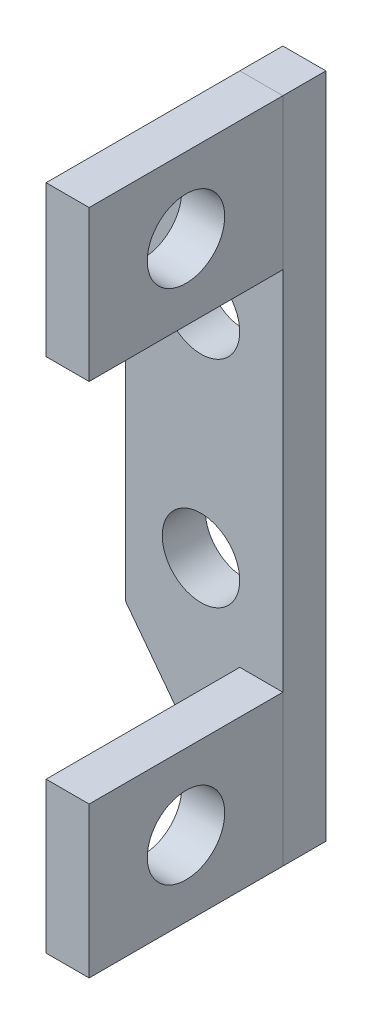
ISO-10303-21;
HEADER;
FILE_DESCRIPTION(('STEP AP214'),'2;1');
FILE_NAME('part.step','',(''),(''),'','','');
FILE_SCHEMA(('AUTOMOTIVE_DESIGN { 1 0 10303 214 1 1 1 1 }'));
ENDSEC;
DATA;
#1=APPLICATION_CONTEXT('core data for automotive mechanical design processes');
#2=APPLICATION_PROTOCOL_DEFINITION('international standard','automotive_design',2000,#1);
#3=PRODUCT_CONTEXT('',#1,'mechanical');
#4=PRODUCT('Part','Part','',(#3));
#5=PRODUCT_RELATED_PRODUCT_CATEGORY('part','',(#4));
#6=PRODUCT_DEFINITION_FORMATION('','',#4);
#7=PRODUCT_DEFINITION_CONTEXT('part definition',#1,'design');
#8=PRODUCT_DEFINITION('design','',#6,#7);
#9=PRODUCT_DEFINITION_SHAPE('','',#8);
#10=(LENGTH_UNIT() NAMED_UNIT(*) SI_UNIT(.MILLI.,.METRE.));
#11=(NAMED_UNIT(*) PLANE_ANGLE_UNIT() SI_UNIT($,.RADIAN.));
#12=(NAMED_UNIT(*) SI_UNIT($,.STERADIAN.) SOLID_ANGLE_UNIT());
#13=UNCERTAINTY_MEASURE_WITH_UNIT(LENGTH_MEASURE(1.E-05),#10,'distance_accuracy_value','');
#14=(GEOMETRIC_REPRESENTATION_CONTEXT(3) GLOBAL_UNCERTAINTY_ASSIGNED_CONTEXT((#13)) GLOBAL_UNIT_ASSIGNED_CONTEXT((#10,
#11,#12)) REPRESENTATION_CONTEXT('',''));
#15=CARTESIAN_POINT('',(0.,0.,0.));
#16=DIRECTION('',(0.,0.,1.));
#17=DIRECTION('',(1.,0.,0.));
#18=AXIS2_PLACEMENT_3D('',#15,#16,#17);
#19=CARTESIAN_POINT('',(-2.6955897908607,196.920635549074,11.));
#20=DIRECTION('',(-1.,0.,0.));
#21=DIRECTION('',(0.,0.,1.));
#22=AXIS2_PLACEMENT_3D('',#19,#20,#21);
#23=PLANE('',#22);
#24=CARTESIAN_POINT('',(-2.6955897908607,193.420635549076,6.5));
#25=DIRECTION('',(-1.,0.,0.));
#26=DIRECTION('',(0.,0.,1.));
#27=AXIS2_PLACEMENT_3D('',#24,#25,#26);
#28=CIRCLE('',#27,1.8);
#29=CARTESIAN_POINT('',(-2.6955897908607,193.420635549076,8.3));
#30=VERTEX_POINT('',#29);
#31=EDGE_CURVE('E123',#30,#30,#28,.T.);
#32=ORIENTED_EDGE('',*,*,#31,.T.);
#33=EDGE_LOOP('',(#32));
#34=FACE_BOUND('',#33,.T.);
#35=DIRECTION('',(0.,1.,0.));
#36=VECTOR('',#35,1.);
#37=CARTESIAN_POINT('',(-2.6955897908607,196.920635549074,2.));
#38=LINE('',#37,#36);
#39=CARTESIAN_POINT('',(-2.6955897908607,189.920635549074,2.));
#40=VERTEX_POINT('',#39);
#41=CARTESIAN_POINT('',(-2.6955897908607,196.920635549074,2.));
#42=VERTEX_POINT('',#41);
#43=EDGE_CURVE('E12',#40,#42,#38,.T.);
#44=ORIENTED_EDGE('',*,*,#43,.T.);
#45=DIRECTION('',(0.,0.,-1.));
#46=VECTOR('',#45,1.);
#47=CARTESIAN_POINT('',(-2.6955897908607,196.920635549074,11.));
#48=LINE('',#47,#46);
#49=CARTESIAN_POINT('',(-2.6955897908607,196.920635549074,11.));
#50=VERTEX_POINT('',#49);
#51=EDGE_CURVE('E122',#50,#42,#48,.T.);
#52=ORIENTED_EDGE('',*,*,#51,.F.);
#53=DIRECTION('',(0.,1.,0.));
#54=VECTOR('',#53,1.);
#55=CARTESIAN_POINT('',(-2.6955897908607,196.920635549074,11.));
#56=LINE('',#55,#54);
#57=CARTESIAN_POINT('',(-2.6955897908607,189.920635549074,11.));
#58=VERTEX_POINT('',#57);
#59=EDGE_CURVE('E55',#58,#50,#56,.T.);
#60=ORIENTED_EDGE('',*,*,#59,.F.);
#61=DIRECTION('',(0.,0.,-1.));
#62=VECTOR('',#61,1.);
#63=CARTESIAN_POINT('',(-2.6955897908607,189.920635549074,11.));
#64=LINE('',#63,#62);
#65=EDGE_CURVE('E110',#58,#40,#64,.T.);
#66=ORIENTED_EDGE('',*,*,#65,.T.);
#67=EDGE_LOOP('',(#44,#52,#60,#66));
#68=FACE_BOUND('',#67,.T.);
#69=ADVANCED_FACE('F51',(#34,#68),#23,.F.);
#70=CARTESIAN_POINT('',(-2.6955897908607,196.920635549074,11.));
#71=DIRECTION('',(0.,-1.,0.));
#72=DIRECTION('',(0.,0.,-1.));
#73=AXIS2_PLACEMENT_3D('',#70,#71,#72);
#74=PLANE('',#73);
#75=DIRECTION('',(-1.,0.,0.));
#76=VECTOR('',#75,1.);
#77=CARTESIAN_POINT('',(-2.6955897908607,196.920635549074,2.));
#78=LINE('',#77,#76);
#79=CARTESIAN_POINT('',(-4.6955897908607,196.920635549074,2.));
#80=VERTEX_POINT('',#79);
#81=EDGE_CURVE('E61',#42,#80,#78,.T.);
#82=ORIENTED_EDGE('',*,*,#81,.T.);
#83=DIRECTION('',(0.,0.,-1.));
#84=VECTOR('',#83,1.);
#85=CARTESIAN_POINT('',(-4.6955897908607,196.920635549074,11.));
#86=LINE('',#85,#84);
#87=CARTESIAN_POINT('',(-4.6955897908607,196.920635549074,11.));
#88=VERTEX_POINT('',#87);
#89=EDGE_CURVE('E106',#88,#80,#86,.T.);
#90=ORIENTED_EDGE('',*,*,#89,.F.);
#91=DIRECTION('',(-1.,0.,0.));
#92=VECTOR('',#91,1.);
#93=CARTESIAN_POINT('',(-2.6955897908607,196.920635549074,11.));
#94=LINE('',#93,#92);
#95=EDGE_CURVE('E85',#50,#88,#94,.T.);
#96=ORIENTED_EDGE('',*,*,#95,.F.);
#97=ORIENTED_EDGE('',*,*,#51,.T.);
#98=EDGE_LOOP('',(#82,#90,#96,#97));
#99=FACE_BOUND('',#98,.T.);
#100=ADVANCED_FACE('F136',(#99),#74,.F.);
#101=CARTESIAN_POINT('',(-4.6955897908607,196.920635549074,11.));
#102=DIRECTION('',(1.,0.,0.));
#103=DIRECTION('',(0.,0.,-1.));
#104=AXIS2_PLACEMENT_3D('',#101,#102,#103);
#105=PLANE('',#104);
#106=CARTESIAN_POINT('',(-4.6955897908607,193.420635549076,6.5));
#107=DIRECTION('',(-1.,0.,0.));
#108=DIRECTION('',(0.,0.,1.));
#109=AXIS2_PLACEMENT_3D('',#106,#107,#108);
#110=CIRCLE('',#109,1.8);
#111=CARTESIAN_POINT('',(-4.6955897908607,193.420635549076,8.3));
#112=VERTEX_POINT('',#111);
#113=EDGE_CURVE('E127',#112,#112,#110,.T.);
#114=ORIENTED_EDGE('',*,*,#113,.F.);
#115=EDGE_LOOP('',(#114));
#116=FACE_BOUND('',#115,.T.);
#117=DIRECTION('',(0.,-1.,0.));
#118=VECTOR('',#117,1.);
#119=CARTESIAN_POINT('',(-4.6955897908607,196.920635549074,2.));
#120=LINE('',#119,#118);
#121=CARTESIAN_POINT('',(-4.6955897908607,189.920635549074,2.));
#122=VERTEX_POINT('',#121);
#123=EDGE_CURVE('E101',#80,#122,#120,.T.);
#124=ORIENTED_EDGE('',*,*,#123,.T.);
#125=DIRECTION('',(0.,0.,-1.));
#126=VECTOR('',#125,1.);
#127=CARTESIAN_POINT('',(-4.6955897908607,189.920635549074,11.));
#128=LINE('',#127,#126);
#129=CARTESIAN_POINT('',(-4.6955897908607,189.920635549074,11.));
#130=VERTEX_POINT('',#129);
#131=EDGE_CURVE('E104',#130,#122,#128,.T.);
#132=ORIENTED_EDGE('',*,*,#131,.F.);
#133=DIRECTION('',(0.,-1.,0.));
#134=VECTOR('',#133,1.);
#135=CARTESIAN_POINT('',(-4.6955897908607,196.920635549074,11.));
#136=LINE('',#135,#134);
#137=EDGE_CURVE('E118',#88,#130,#136,.T.);
#138=ORIENTED_EDGE('',*,*,#137,.F.);
#139=ORIENTED_EDGE('',*,*,#89,.T.);
#140=EDGE_LOOP('',(#124,#132,#138,#139));
#141=FACE_BOUND('',#140,.T.);
#142=ADVANCED_FACE('F102',(#116,#141),#105,.F.);
#143=CARTESIAN_POINT('',(-2.6955897908607,189.920635549074,11.));
#144=DIRECTION('',(0.,1.,0.));
#145=DIRECTION('',(0.,0.,1.));
#146=AXIS2_PLACEMENT_3D('',#143,#144,#145);
#147=PLANE('',#146);
#148=DIRECTION('',(1.,0.,0.));
#149=VECTOR('',#148,1.);
#150=CARTESIAN_POINT('',(-2.6955897908607,189.920635549074,2.));
#151=LINE('',#150,#149);
#152=EDGE_CURVE('E95',#122,#40,#151,.T.);
#153=ORIENTED_EDGE('',*,*,#152,.T.);
#154=ORIENTED_EDGE('',*,*,#65,.F.);
#155=DIRECTION('',(1.,0.,0.));
#156=VECTOR('',#155,1.);
#157=CARTESIAN_POINT('',(-2.6955897908607,189.920635549074,11.));
#158=LINE('',#157,#156);
#159=EDGE_CURVE('E109',#130,#58,#158,.T.);
#160=ORIENTED_EDGE('',*,*,#159,.F.);
#161=ORIENTED_EDGE('',*,*,#131,.T.);
#162=EDGE_LOOP('',(#153,#154,#160,#161));
#163=FACE_BOUND('',#162,.T.);
#164=ADVANCED_FACE('F108',(#163),#147,.F.);
#165=CARTESIAN_POINT('',(0.,0.,11.));
#166=DIRECTION('',(0.,0.,-1.));
#167=DIRECTION('',(-1.,0.,0.));
#168=AXIS2_PLACEMENT_3D('',#165,#166,#167);
#169=PLANE('',#168);
#170=ORIENTED_EDGE('',*,*,#59,.T.);
#171=ORIENTED_EDGE('',*,*,#95,.T.);
#172=ORIENTED_EDGE('',*,*,#137,.T.);
#173=ORIENTED_EDGE('',*,*,#159,.T.);
#174=EDGE_LOOP('',(#170,#171,#172,#173));
#175=FACE_BOUND('',#174,.T.);
#176=ADVANCED_FACE('F53',(#175),#169,.F.);
#177=CARTESIAN_POINT('',(0.,0.,2.));
#178=DIRECTION('',(0.,0.,-1.));
#179=DIRECTION('',(-1.,0.,0.));
#180=AXIS2_PLACEMENT_3D('',#177,#178,#179);
#181=PLANE('',#180);
#182=ORIENTED_EDGE('',*,*,#43,.F.);
#183=ORIENTED_EDGE('',*,*,#152,.F.);
#184=ORIENTED_EDGE('',*,*,#123,.F.);
#185=ORIENTED_EDGE('',*,*,#81,.F.);
#186=EDGE_LOOP('',(#182,#183,#184,#185));
#187=FACE_BOUND('',#186,.T.);
#188=ADVANCED_FACE('F112',(#187),#181,.T.);
#189=CARTESIAN_POINT('',(-4.6955897908607,193.420635549076,6.5));
#190=DIRECTION('',(-1.,0.,0.));
#191=DIRECTION('',(0.,0.,1.));
#192=AXIS2_PLACEMENT_3D('',#189,#190,#191);
#193=CYLINDRICAL_SURFACE('',#192,1.8);
#194=ORIENTED_EDGE('',*,*,#31,.F.);
#195=EDGE_LOOP('',(#194));
#196=FACE_BOUND('',#195,.T.);
#197=ORIENTED_EDGE('',*,*,#113,.T.);
#198=EDGE_LOOP('',(#197));
#199=FACE_BOUND('',#198,.T.);
#200=ADVANCED_FACE('F133',(#196,#199),#193,.F.);
#201=CLOSED_SHELL('',(#69,#100,#142,#164,#176,#188,#200));
#202=MANIFOLD_SOLID_BREP('B2',#201);
#203=CARTESIAN_POINT('',(-2.6955897908607,213.920635549073,11.));
#204=DIRECTION('',(-1.,0.,0.));
#205=DIRECTION('',(0.,0.,1.));
#206=AXIS2_PLACEMENT_3D('',#203,#204,#205);
#207=PLANE('',#206);
#208=CARTESIAN_POINT('',(-2.6955897908607,217.420635549076,6.5));
#209=DIRECTION('',(-1.,0.,0.));
#210=DIRECTION('',(0.,0.,1.));
#211=AXIS2_PLACEMENT_3D('',#208,#209,#210);
#212=CIRCLE('',#211,1.8);
#213=CARTESIAN_POINT('',(-2.6955897908607,217.420635549076,8.3));
#214=VERTEX_POINT('',#213);
#215=EDGE_CURVE('E270',#214,#214,#212,.T.);
#216=ORIENTED_EDGE('',*,*,#215,.T.);
#217=EDGE_LOOP('',(#216));
#218=FACE_BOUND('',#217,.T.);
#219=DIRECTION('',(0.,1.,0.));
#220=VECTOR('',#219,1.);
#221=CARTESIAN_POINT('',(-2.6955897908607,213.920635549073,2.));
#222=LINE('',#221,#220);
#223=CARTESIAN_POINT('',(-2.6955897908607,213.920635549073,2.));
#224=VERTEX_POINT('',#223);
#225=CARTESIAN_POINT('',(-2.6955897908607,220.920635549073,2.));
#226=VERTEX_POINT('',#225);
#227=EDGE_CURVE('E267',#224,#226,#222,.T.);
#228=ORIENTED_EDGE('',*,*,#227,.T.);
#229=DIRECTION('',(0.,0.,-1.));
#230=VECTOR('',#229,1.);
#231=CARTESIAN_POINT('',(-2.6955897908607,220.920635549073,11.));
#232=LINE('',#231,#230);
#233=CARTESIAN_POINT('',(-2.6955897908607,220.920635549073,11.));
#234=VERTEX_POINT('',#233);
#235=EDGE_CURVE('E49',#234,#226,#232,.T.);
#236=ORIENTED_EDGE('',*,*,#235,.F.);
#237=DIRECTION('',(0.,1.,0.));
#238=VECTOR('',#237,1.);
#239=CARTESIAN_POINT('',(-2.6955897908607,213.920635549073,11.));
#240=LINE('',#239,#238);
#241=CARTESIAN_POINT('',(-2.6955897908607,213.920635549073,11.));
#242=VERTEX_POINT('',#241);
#243=EDGE_CURVE('E255',#242,#234,#240,.T.);
#244=ORIENTED_EDGE('',*,*,#243,.F.);
#245=DIRECTION('',(0.,0.,-1.));
#246=VECTOR('',#245,1.);
#247=CARTESIAN_POINT('',(-2.6955897908607,213.920635549073,11.));
#248=LINE('',#247,#246);
#249=EDGE_CURVE('E263',#242,#224,#248,.T.);
#250=ORIENTED_EDGE('',*,*,#249,.T.);
#251=EDGE_LOOP('',(#228,#236,#244,#250));
#252=FACE_BOUND('',#251,.T.);
#253=ADVANCED_FACE('F204',(#218,#252),#207,.F.);
#254=CARTESIAN_POINT('',(-2.6955897908607,220.920635549073,11.));
#255=DIRECTION('',(0.,-1.,0.));
#256=DIRECTION('',(0.,0.,-1.));
#257=AXIS2_PLACEMENT_3D('',#254,#255,#256);
#258=PLANE('',#257);
#259=DIRECTION('',(-1.,0.,0.));
#260=VECTOR('',#259,1.);
#261=CARTESIAN_POINT('',(-2.6955897908607,220.920635549073,2.));
#262=LINE('',#261,#260);
#263=CARTESIAN_POINT('',(-4.6955897908607,220.920635549073,2.));
#264=VERTEX_POINT('',#263);
#265=EDGE_CURVE('E259',#226,#264,#262,.T.);
#266=ORIENTED_EDGE('',*,*,#265,.T.);
#267=DIRECTION('',(0.,0.,-1.));
#268=VECTOR('',#267,1.);
#269=CARTESIAN_POINT('',(-4.6955897908607,220.920635549073,11.));
#270=LINE('',#269,#268);
#271=CARTESIAN_POINT('',(-4.6955897908607,220.920635549073,11.));
#272=VERTEX_POINT('',#271);
#273=EDGE_CURVE('E212',#272,#264,#270,.T.);
#274=ORIENTED_EDGE('',*,*,#273,.F.);
#275=DIRECTION('',(-1.,0.,0.));
#276=VECTOR('',#275,1.);
#277=CARTESIAN_POINT('',(-2.6955897908607,220.920635549073,11.));
#278=LINE('',#277,#276);
#279=EDGE_CURVE('E250',#234,#272,#278,.T.);
#280=ORIENTED_EDGE('',*,*,#279,.F.);
#281=ORIENTED_EDGE('',*,*,#235,.T.);
#282=EDGE_LOOP('',(#266,#274,#280,#281));
#283=FACE_BOUND('',#282,.T.);
#284=ADVANCED_FACE('F258',(#283),#258,.F.);
#285=CARTESIAN_POINT('',(-4.6955897908607,213.920635549073,11.));
#286=DIRECTION('',(1.,0.,0.));
#287=DIRECTION('',(0.,0.,-1.));
#288=AXIS2_PLACEMENT_3D('',#285,#286,#287);
#289=PLANE('',#288);
#290=CARTESIAN_POINT('',(-4.6955897908607,217.420635549076,6.5));
#291=DIRECTION('',(-1.,0.,0.));
#292=DIRECTION('',(0.,0.,1.));
#293=AXIS2_PLACEMENT_3D('',#290,#291,#292);
#294=CIRCLE('',#293,1.8);
#295=CARTESIAN_POINT('',(-4.6955897908607,217.420635549076,8.3));
#296=VERTEX_POINT('',#295);
#297=EDGE_CURVE('E283',#296,#296,#294,.T.);
#298=ORIENTED_EDGE('',*,*,#297,.F.);
#299=EDGE_LOOP('',(#298));
#300=FACE_BOUND('',#299,.T.);
#301=DIRECTION('',(0.,-1.,0.));
#302=VECTOR('',#301,1.);
#303=CARTESIAN_POINT('',(-4.6955897908607,213.920635549073,2.));
#304=LINE('',#303,#302);
#305=CARTESIAN_POINT('',(-4.6955897908607,213.920635549073,2.));
#306=VERTEX_POINT('',#305);
#307=EDGE_CURVE('E237',#264,#306,#304,.T.);
#308=ORIENTED_EDGE('',*,*,#307,.T.);
#309=DIRECTION('',(0.,0.,-1.));
#310=VECTOR('',#309,1.);
#311=CARTESIAN_POINT('',(-4.6955897908607,213.920635549073,11.));
#312=LINE('',#311,#310);
#313=CARTESIAN_POINT('',(-4.6955897908607,213.920635549073,11.));
#314=VERTEX_POINT('',#313);
#315=EDGE_CURVE('E260',#314,#306,#312,.T.);
#316=ORIENTED_EDGE('',*,*,#315,.F.);
#317=DIRECTION('',(0.,-1.,0.));
#318=VECTOR('',#317,1.);
#319=CARTESIAN_POINT('',(-4.6955897908607,213.920635549073,11.));
#320=LINE('',#319,#318);
#321=EDGE_CURVE('E253',#272,#314,#320,.T.);
#322=ORIENTED_EDGE('',*,*,#321,.F.);
#323=ORIENTED_EDGE('',*,*,#273,.T.);
#324=EDGE_LOOP('',(#308,#316,#322,#323));
#325=FACE_BOUND('',#324,.T.);
#326=ADVANCED_FACE('F261',(#300,#325),#289,.F.);
#327=CARTESIAN_POINT('',(-2.6955897908607,213.920635549073,11.));
#328=DIRECTION('',(0.,1.,0.));
#329=DIRECTION('',(0.,0.,1.));
#330=AXIS2_PLACEMENT_3D('',#327,#328,#329);
#331=PLANE('',#330);
#332=DIRECTION('',(1.,0.,0.));
#333=VECTOR('',#332,1.);
#334=CARTESIAN_POINT('',(-2.6955897908607,213.920635549073,2.));
#335=LINE('',#334,#333);
#336=EDGE_CURVE('E243',#306,#224,#335,.T.);
#337=ORIENTED_EDGE('',*,*,#336,.T.);
#338=ORIENTED_EDGE('',*,*,#249,.F.);
#339=DIRECTION('',(1.,0.,0.));
#340=VECTOR('',#339,1.);
#341=CARTESIAN_POINT('',(-2.6955897908607,213.920635549073,11.));
#342=LINE('',#341,#340);
#343=EDGE_CURVE('E220',#314,#242,#342,.T.);
#344=ORIENTED_EDGE('',*,*,#343,.F.);
#345=ORIENTED_EDGE('',*,*,#315,.T.);
#346=EDGE_LOOP('',(#337,#338,#344,#345));
#347=FACE_BOUND('',#346,.T.);
#348=ADVANCED_FACE('F275',(#347),#331,.F.);
#349=CARTESIAN_POINT('',(0.,0.,11.));
#350=DIRECTION('',(0.,0.,1.));
#351=DIRECTION('',(1.,0.,0.));
#352=AXIS2_PLACEMENT_3D('',#349,#350,#351);
#353=PLANE('',#352);
#354=ORIENTED_EDGE('',*,*,#243,.T.);
#355=ORIENTED_EDGE('',*,*,#279,.T.);
#356=ORIENTED_EDGE('',*,*,#321,.T.);
#357=ORIENTED_EDGE('',*,*,#343,.T.);
#358=EDGE_LOOP('',(#354,#355,#356,#357));
#359=FACE_BOUND('',#358,.T.);
#360=ADVANCED_FACE('F251',(#359),#353,.T.);
#361=CARTESIAN_POINT('',(0.,0.,2.));
#362=DIRECTION('',(0.,0.,1.));
#363=DIRECTION('',(1.,0.,0.));
#364=AXIS2_PLACEMENT_3D('',#361,#362,#363);
#365=PLANE('',#364);
#366=ORIENTED_EDGE('',*,*,#227,.F.);
#367=ORIENTED_EDGE('',*,*,#336,.F.);
#368=ORIENTED_EDGE('',*,*,#307,.F.);
#369=ORIENTED_EDGE('',*,*,#265,.F.);
#370=EDGE_LOOP('',(#366,#367,#368,#369));
#371=FACE_BOUND('',#370,.T.);
#372=ADVANCED_FACE('F278',(#371),#365,.F.);
#373=CARTESIAN_POINT('',(-4.6955897908607,217.420635549076,6.5));
#374=DIRECTION('',(-1.,0.,0.));
#375=DIRECTION('',(0.,0.,1.));
#376=AXIS2_PLACEMENT_3D('',#373,#374,#375);
#377=CYLINDRICAL_SURFACE('',#376,1.8);
#378=ORIENTED_EDGE('',*,*,#215,.F.);
#379=EDGE_LOOP('',(#378));
#380=FACE_BOUND('',#379,.T.);
#381=ORIENTED_EDGE('',*,*,#297,.T.);
#382=EDGE_LOOP('',(#381));
#383=FACE_BOUND('',#382,.T.);
#384=ADVANCED_FACE('F287',(#380,#383),#377,.F.);
#385=CLOSED_SHELL('',(#253,#284,#326,#348,#360,#372,#384));
#386=MANIFOLD_SOLID_BREP('B6',#385);
#387=CARTESIAN_POINT('',(88.4381730466334,67.0160497122919,2.));
#388=DIRECTION('',(-0.797016517501917,-0.603957507469786,0.));
#389=DIRECTION('',(0.603957507469786,-0.797016517501917,0.));
#390=AXIS2_PLACEMENT_3D('',#387,#388,#389);
#391=PLANE('',#390);
#392=DIRECTION('',(-0.603957507469786,0.797016517501917,0.));
#393=VECTOR('',#392,1.);
#394=CARTESIAN_POINT('',(88.4381730466334,67.0160497122919,0.));
#395=LINE('',#394,#393);
#396=CARTESIAN_POINT('',(-4.6955897908607,189.920635549074,0.));
#397=VERTEX_POINT('',#396);
#398=CARTESIAN_POINT('',(-9.99999999999835,196.920635549074,0.));
#399=VERTEX_POINT('',#398);
#400=EDGE_CURVE('E429',#397,#399,#395,.T.);
#401=ORIENTED_EDGE('',*,*,#400,.F.);
#402=DIRECTION('',(0.,0.,-1.));
#403=VECTOR('',#402,1.);
#404=CARTESIAN_POINT('',(-4.6955897908607,189.920635549074,2.));
#405=LINE('',#404,#403);
#406=CARTESIAN_POINT('',(-4.6955897908607,189.920635549074,2.));
#407=VERTEX_POINT('',#406);
#408=EDGE_CURVE('E202',#407,#397,#405,.T.);
#409=ORIENTED_EDGE('',*,*,#408,.F.);
#410=DIRECTION('',(-0.603957507469786,0.797016517501917,0.));
#411=VECTOR('',#410,1.);
#412=CARTESIAN_POINT('',(88.4381730466334,67.0160497122919,2.));
#413=LINE('',#412,#411);
#414=CARTESIAN_POINT('',(-9.99999999999835,196.920635549074,2.));
#415=VERTEX_POINT('',#414);
#416=EDGE_CURVE('E444',#407,#415,#413,.T.);
#417=ORIENTED_EDGE('',*,*,#416,.T.);
#418=DIRECTION('',(0.,0.,-1.));
#419=VECTOR('',#418,1.);
#420=CARTESIAN_POINT('',(-9.99999999999835,196.920635549074,2.));
#421=LINE('',#420,#419);
#422=EDGE_CURVE('E364',#415,#399,#421,.T.);
#423=ORIENTED_EDGE('',*,*,#422,.T.);
#424=EDGE_LOOP('',(#401,#409,#417,#423));
#425=FACE_BOUND('',#424,.T.);
#426=ADVANCED_FACE('F348',(#425),#391,.T.);
#427=CARTESIAN_POINT('',(0.,189.920635549074,2.));
#428=DIRECTION('',(0.,-1.,0.));
#429=DIRECTION('',(0.,0.,-1.));
#430=AXIS2_PLACEMENT_3D('',#427,#428,#429);
#431=PLANE('',#430);
#432=DIRECTION('',(-1.,0.,0.));
#433=VECTOR('',#432,1.);
#434=CARTESIAN_POINT('',(0.,189.920635549074,0.));
#435=LINE('',#434,#433);
#436=CARTESIAN_POINT('',(-2.6955897908607,189.920635549074,0.));
#437=VERTEX_POINT('',#436);
#438=EDGE_CURVE('E431',#437,#397,#435,.T.);
#439=ORIENTED_EDGE('',*,*,#438,.F.);
#440=DIRECTION('',(0.,0.,-1.));
#441=VECTOR('',#440,1.);
#442=CARTESIAN_POINT('',(-2.6955897908607,189.920635549074,2.));
#443=LINE('',#442,#441);
#444=CARTESIAN_POINT('',(-2.6955897908607,189.920635549074,2.));
#445=VERTEX_POINT('',#444);
#446=EDGE_CURVE('E356',#445,#437,#443,.T.);
#447=ORIENTED_EDGE('',*,*,#446,.F.);
#448=DIRECTION('',(-1.,0.,0.));
#449=VECTOR('',#448,1.);
#450=CARTESIAN_POINT('',(0.,189.920635549074,2.));
#451=LINE('',#450,#449);
#452=EDGE_CURVE('E556',#445,#407,#451,.T.);
#453=ORIENTED_EDGE('',*,*,#452,.T.);
#454=ORIENTED_EDGE('',*,*,#408,.T.);
#455=EDGE_LOOP('',(#439,#447,#453,#454));
#456=FACE_BOUND('',#455,.T.);
#457=ADVANCED_FACE('F453',(#456),#431,.T.);
#458=CARTESIAN_POINT('',(-2.69558979086068,0.,2.));
#459=DIRECTION('',(1.,0.,0.));
#460=DIRECTION('',(0.,1.,0.));
#461=AXIS2_PLACEMENT_3D('',#458,#459,#460);
#462=PLANE('',#461);
#463=DIRECTION('',(0.,-1.,0.));
#464=VECTOR('',#463,1.);
#465=CARTESIAN_POINT('',(-2.69558979086068,0.,0.));
#466=LINE('',#465,#464);
#467=CARTESIAN_POINT('',(-2.6955897908607,220.920635549073,0.));
#468=VERTEX_POINT('',#467);
#469=EDGE_CURVE('E435',#468,#437,#466,.T.);
#470=ORIENTED_EDGE('',*,*,#469,.F.);
#471=DIRECTION('',(0.,0.,-1.));
#472=VECTOR('',#471,1.);
#473=CARTESIAN_POINT('',(-2.6955897908607,220.920635549073,2.));
#474=LINE('',#473,#472);
#475=CARTESIAN_POINT('',(-2.6955897908607,220.920635549073,2.));
#476=VERTEX_POINT('',#475);
#477=EDGE_CURVE('E421',#476,#468,#474,.T.);
#478=ORIENTED_EDGE('',*,*,#477,.F.);
#479=DIRECTION('',(0.,-1.,0.));
#480=VECTOR('',#479,1.);
#481=CARTESIAN_POINT('',(-2.69558979086068,0.,2.));
#482=LINE('',#481,#480);
#483=EDGE_CURVE('E411',#476,#445,#482,.T.);
#484=ORIENTED_EDGE('',*,*,#483,.T.);
#485=ORIENTED_EDGE('',*,*,#446,.T.);
#486=EDGE_LOOP('',(#470,#478,#484,#485));
#487=FACE_BOUND('',#486,.T.);
#488=ADVANCED_FACE('F450',(#487),#462,.T.);
#489=CARTESIAN_POINT('',(0.,220.920635549073,2.));
#490=DIRECTION('',(0.,-1.,0.));
#491=DIRECTION('',(0.,0.,-1.));
#492=AXIS2_PLACEMENT_3D('',#489,#490,#491);
#493=PLANE('',#492);
#494=DIRECTION('',(-1.,0.,0.));
#495=VECTOR('',#494,1.);
#496=CARTESIAN_POINT('',(0.,220.920635549073,0.));
#497=LINE('',#496,#495);
#498=CARTESIAN_POINT('',(-4.6955897908607,220.920635549073,0.));
#499=VERTEX_POINT('',#498);
#500=EDGE_CURVE('E418',#468,#499,#497,.T.);
#501=ORIENTED_EDGE('',*,*,#500,.T.);
#502=DIRECTION('',(0.,0.,-1.));
#503=VECTOR('',#502,1.);
#504=CARTESIAN_POINT('',(-4.6955897908607,220.920635549073,2.));
#505=LINE('',#504,#503);
#506=CARTESIAN_POINT('',(-4.6955897908607,220.920635549073,2.));
#507=VERTEX_POINT('',#506);
#508=EDGE_CURVE('E415',#507,#499,#505,.T.);
#509=ORIENTED_EDGE('',*,*,#508,.F.);
#510=DIRECTION('',(-1.,0.,0.));
#511=VECTOR('',#510,1.);
#512=CARTESIAN_POINT('',(0.,220.920635549073,2.));
#513=LINE('',#512,#511);
#514=EDGE_CURVE('E403',#476,#507,#513,.T.);
#515=ORIENTED_EDGE('',*,*,#514,.F.);
#516=ORIENTED_EDGE('',*,*,#477,.T.);
#517=EDGE_LOOP('',(#501,#509,#515,#516));
#518=FACE_BOUND('',#517,.T.);
#519=ADVANCED_FACE('F416',(#518),#493,.F.);
#520=CARTESIAN_POINT('',(-109.326069488535,82.8443313028393,2.));
#521=DIRECTION('',(0.797016517501917,-0.603957507469786,0.));
#522=DIRECTION('',(0.603957507469786,0.797016517501917,0.));
#523=AXIS2_PLACEMENT_3D('',#520,#521,#522);
#524=PLANE('',#523);
#525=DIRECTION('',(-0.603957507469786,-0.797016517501917,0.));
#526=VECTOR('',#525,1.);
#527=CARTESIAN_POINT('',(-109.326069488535,82.8443313028393,0.));
#528=LINE('',#527,#526);
#529=CARTESIAN_POINT('',(-9.99999999999835,213.920635549073,0.));
#530=VERTEX_POINT('',#529);
#531=EDGE_CURVE('E439',#499,#530,#528,.T.);
#532=ORIENTED_EDGE('',*,*,#531,.T.);
#533=DIRECTION('',(0.,0.,-1.));
#534=VECTOR('',#533,1.);
#535=CARTESIAN_POINT('',(-9.99999999999835,213.920635549073,2.));
#536=LINE('',#535,#534);
#537=CARTESIAN_POINT('',(-9.99999999999835,213.920635549073,2.));
#538=VERTEX_POINT('',#537);
#539=EDGE_CURVE('E384',#538,#530,#536,.T.);
#540=ORIENTED_EDGE('',*,*,#539,.F.);
#541=DIRECTION('',(-0.603957507469786,-0.797016517501917,0.));
#542=VECTOR('',#541,1.);
#543=CARTESIAN_POINT('',(-109.326069488535,82.8443313028393,2.));
#544=LINE('',#543,#542);
#545=EDGE_CURVE('E408',#507,#538,#544,.T.);
#546=ORIENTED_EDGE('',*,*,#545,.F.);
#547=ORIENTED_EDGE('',*,*,#508,.T.);
#548=EDGE_LOOP('',(#532,#540,#546,#547));
#549=FACE_BOUND('',#548,.T.);
#550=ADVANCED_FACE('F423',(#549),#524,.F.);
#551=CARTESIAN_POINT('',(-9.99999999999835,0.,2.));
#552=DIRECTION('',(-1.,0.,0.));
#553=DIRECTION('',(0.,0.,1.));
#554=AXIS2_PLACEMENT_3D('',#551,#552,#553);
#555=PLANE('',#554);
#556=DIRECTION('',(0.,1.,0.));
#557=VECTOR('',#556,1.);
#558=CARTESIAN_POINT('',(-9.99999999999835,0.,0.));
#559=LINE('',#558,#557);
#560=EDGE_CURVE('E441',#399,#530,#559,.T.);
#561=ORIENTED_EDGE('',*,*,#560,.F.);
#562=ORIENTED_EDGE('',*,*,#422,.F.);
#563=DIRECTION('',(0.,1.,0.));
#564=VECTOR('',#563,1.);
#565=CARTESIAN_POINT('',(-9.99999999999835,0.,2.));
#566=LINE('',#565,#564);
#567=EDGE_CURVE('E424',#415,#538,#566,.T.);
#568=ORIENTED_EDGE('',*,*,#567,.T.);
#569=ORIENTED_EDGE('',*,*,#539,.T.);
#570=EDGE_LOOP('',(#561,#562,#568,#569));
#571=FACE_BOUND('',#570,.T.);
#572=ADVANCED_FACE('F456',(#571),#555,.T.);
#573=CARTESIAN_POINT('',(0.,0.,2.));
#574=DIRECTION('',(0.,0.,1.));
#575=DIRECTION('',(1.,0.,0.));
#576=AXIS2_PLACEMENT_3D('',#573,#574,#575);
#577=PLANE('',#576);
#578=CARTESIAN_POINT('',(-6.49999999999864,200.420635549073,2.));
#579=DIRECTION('',(0.,0.,1.));
#580=DIRECTION('',(1.,0.,0.));
#581=AXIS2_PLACEMENT_3D('',#578,#579,#580);
#582=CIRCLE('',#581,1.79999999999999);
#583=CARTESIAN_POINT('',(-4.69999999999866,200.420635549073,2.));
#584=VERTEX_POINT('',#583);
#585=EDGE_CURVE('E546',#584,#584,#582,.T.);
#586=ORIENTED_EDGE('',*,*,#585,.F.);
#587=EDGE_LOOP('',(#586));
#588=FACE_BOUND('',#587,.T.);
#589=CARTESIAN_POINT('',(-6.49999999999873,210.420635549073,2.));
#590=DIRECTION('',(0.,0.,1.));
#591=DIRECTION('',(1.,0.,0.));
#592=AXIS2_PLACEMENT_3D('',#589,#590,#591);
#593=CIRCLE('',#592,1.79999999999999);
#594=CARTESIAN_POINT('',(-4.69999999999874,210.420635549073,2.));
#595=VERTEX_POINT('',#594);
#596=EDGE_CURVE('E548',#595,#595,#593,.T.);
#597=ORIENTED_EDGE('',*,*,#596,.F.);
#598=EDGE_LOOP('',(#597));
#599=FACE_BOUND('',#598,.T.);
#600=ORIENTED_EDGE('',*,*,#416,.F.);
#601=ORIENTED_EDGE('',*,*,#452,.F.);
#602=ORIENTED_EDGE('',*,*,#483,.F.);
#603=ORIENTED_EDGE('',*,*,#514,.T.);
#604=ORIENTED_EDGE('',*,*,#545,.T.);
#605=ORIENTED_EDGE('',*,*,#567,.F.);
#606=EDGE_LOOP('',(#600,#601,#602,#603,#604,#605));
#607=FACE_BOUND('',#606,.T.);
#608=ADVANCED_FACE('F405',(#588,#599,#607),#577,.T.);
#609=CARTESIAN_POINT('',(0.,0.,0.));
#610=DIRECTION('',(0.,0.,1.));
#611=DIRECTION('',(1.,0.,0.));
#612=AXIS2_PLACEMENT_3D('',#609,#610,#611);
#613=PLANE('',#612);
#614=CARTESIAN_POINT('',(-6.49999999999864,200.420635549073,0.));
#615=DIRECTION('',(0.,0.,1.));
#616=DIRECTION('',(1.,0.,0.));
#617=AXIS2_PLACEMENT_3D('',#614,#615,#616);
#618=CIRCLE('',#617,1.8);
#619=CARTESIAN_POINT('',(-4.69999999999864,200.420635549073,0.));
#620=VERTEX_POINT('',#619);
#621=EDGE_CURVE('E543',#620,#620,#618,.T.);
#622=ORIENTED_EDGE('',*,*,#621,.T.);
#623=EDGE_LOOP('',(#622));
#624=FACE_BOUND('',#623,.T.);
#625=CARTESIAN_POINT('',(-6.49999999999873,210.420635549073,0.));
#626=DIRECTION('',(0.,0.,1.));
#627=DIRECTION('',(1.,0.,0.));
#628=AXIS2_PLACEMENT_3D('',#625,#626,#627);
#629=CIRCLE('',#628,1.8);
#630=CARTESIAN_POINT('',(-4.69999999999873,210.420635549073,0.));
#631=VERTEX_POINT('',#630);
#632=EDGE_CURVE('E432',#631,#631,#629,.T.);
#633=ORIENTED_EDGE('',*,*,#632,.T.);
#634=EDGE_LOOP('',(#633));
#635=FACE_BOUND('',#634,.T.);
#636=ORIENTED_EDGE('',*,*,#400,.T.);
#637=ORIENTED_EDGE('',*,*,#560,.T.);
#638=ORIENTED_EDGE('',*,*,#531,.F.);
#639=ORIENTED_EDGE('',*,*,#500,.F.);
#640=ORIENTED_EDGE('',*,*,#469,.T.);
#641=ORIENTED_EDGE('',*,*,#438,.T.);
#642=EDGE_LOOP('',(#636,#637,#638,#639,#640,#641));
#643=FACE_BOUND('',#642,.T.);
#644=ADVANCED_FACE('F455',(#624,#635,#643),#613,.F.);
#645=CARTESIAN_POINT('',(-6.49999999999873,210.420635549073,2.));
#646=DIRECTION('',(0.,0.,1.));
#647=DIRECTION('',(1.,0.,0.));
#648=AXIS2_PLACEMENT_3D('',#645,#646,#647);
#649=CYLINDRICAL_SURFACE('',#648,1.79999999999999);
#650=ORIENTED_EDGE('',*,*,#632,.F.);
#651=EDGE_LOOP('',(#650));
#652=FACE_BOUND('',#651,.T.);
#653=ORIENTED_EDGE('',*,*,#596,.T.);
#654=EDGE_LOOP('',(#653));
#655=FACE_BOUND('',#654,.T.);
#656=ADVANCED_FACE('F512',(#652,#655),#649,.F.);
#657=CARTESIAN_POINT('',(-6.49999999999864,200.420635549073,2.));
#658=DIRECTION('',(0.,0.,1.));
#659=DIRECTION('',(1.,0.,0.));
#660=AXIS2_PLACEMENT_3D('',#657,#658,#659);
#661=CYLINDRICAL_SURFACE('',#660,1.79999999999999);
#662=ORIENTED_EDGE('',*,*,#621,.F.);
#663=EDGE_LOOP('',(#662));
#664=FACE_BOUND('',#663,.T.);
#665=ORIENTED_EDGE('',*,*,#585,.T.);
#666=EDGE_LOOP('',(#665));
#667=FACE_BOUND('',#666,.T.);
#668=ADVANCED_FACE('F527',(#664,#667),#661,.F.);
#669=CLOSED_SHELL('',(#426,#457,#488,#519,#550,#572,#608,#644,#656,#668));
#670=MANIFOLD_SOLID_BREP('B43',#669);
#671=ADVANCED_BREP_SHAPE_REPRESENTATION('',(#18,#202,#386,#670),#14);
#672=SHAPE_DEFINITION_REPRESENTATION(#9,#671);
ENDSEC;
END-ISO-10303-21;
